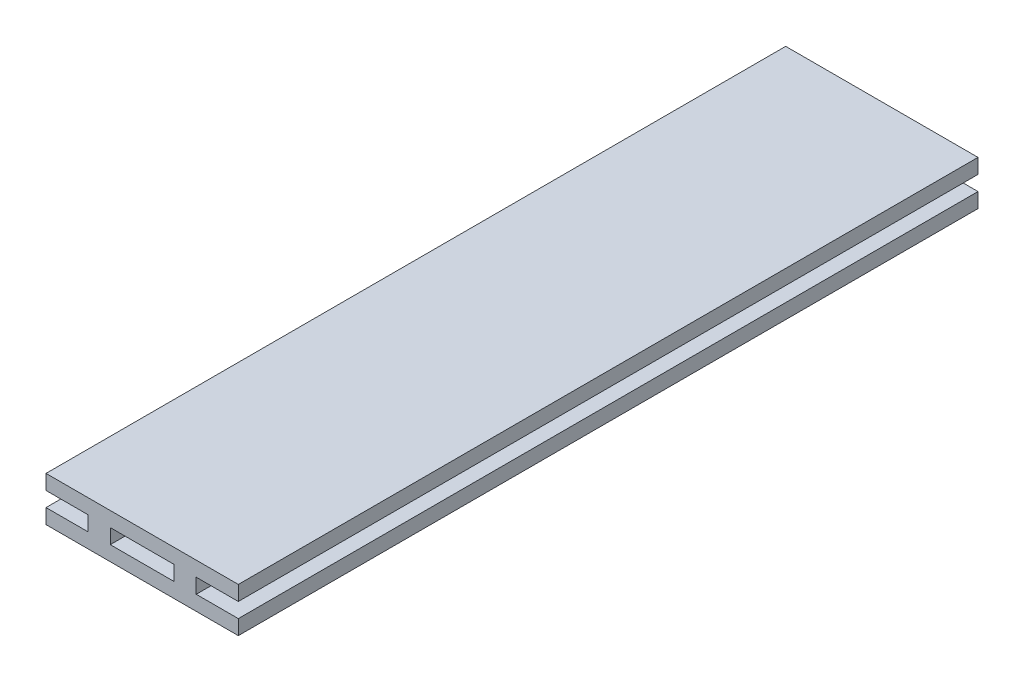
ISO-10303-21;
HEADER;
FILE_DESCRIPTION(('STEP AP214'),'2;1');
FILE_NAME('part.step','',(''),(''),'','','');
FILE_SCHEMA(('AUTOMOTIVE_DESIGN { 1 0 10303 214 1 1 1 1 }'));
ENDSEC;
DATA;
#1=APPLICATION_CONTEXT('core data for automotive mechanical design processes');
#2=APPLICATION_PROTOCOL_DEFINITION('international standard','automotive_design',2000,#1);
#3=PRODUCT_CONTEXT('',#1,'mechanical');
#4=PRODUCT('Part','Part','',(#3));
#5=PRODUCT_RELATED_PRODUCT_CATEGORY('part','',(#4));
#6=PRODUCT_DEFINITION_FORMATION('','',#4);
#7=PRODUCT_DEFINITION_CONTEXT('part definition',#1,'design');
#8=PRODUCT_DEFINITION('design','',#6,#7);
#9=PRODUCT_DEFINITION_SHAPE('','',#8);
#10=(LENGTH_UNIT() NAMED_UNIT(*) SI_UNIT(.MILLI.,.METRE.));
#11=(NAMED_UNIT(*) PLANE_ANGLE_UNIT() SI_UNIT($,.RADIAN.));
#12=(NAMED_UNIT(*) SI_UNIT($,.STERADIAN.) SOLID_ANGLE_UNIT());
#13=UNCERTAINTY_MEASURE_WITH_UNIT(LENGTH_MEASURE(1.E-05),#10,'distance_accuracy_value','');
#14=(GEOMETRIC_REPRESENTATION_CONTEXT(3) GLOBAL_UNCERTAINTY_ASSIGNED_CONTEXT((#13)) GLOBAL_UNIT_ASSIGNED_CONTEXT((#10,
#11,#12)) REPRESENTATION_CONTEXT('',''));
#15=CARTESIAN_POINT('',(0.,0.,0.));
#16=DIRECTION('',(0.,0.,1.));
#17=DIRECTION('',(1.,0.,0.));
#18=AXIS2_PLACEMENT_3D('',#15,#16,#17);
#19=CARTESIAN_POINT('',(0.,1.,100.));
#20=DIRECTION('',(0.,1.,0.));
#21=DIRECTION('',(0.,0.,1.));
#22=AXIS2_PLACEMENT_3D('',#19,#20,#21);
#23=PLANE('',#22);
#24=DIRECTION('',(1.,0.,0.));
#25=VECTOR('',#24,1.);
#26=CARTESIAN_POINT('',(0.,1.,0.));
#27=LINE('',#26,#25);
#28=CARTESIAN_POINT('',(-4.31117093449988,1.,0.));
#29=VERTEX_POINT('',#28);
#30=CARTESIAN_POINT('',(4.31117093449988,1.,0.));
#31=VERTEX_POINT('',#30);
#32=EDGE_CURVE('E236',#29,#31,#27,.T.);
#33=ORIENTED_EDGE('',*,*,#32,.T.);
#34=DIRECTION('',(0.,0.,-1.));
#35=VECTOR('',#34,1.);
#36=CARTESIAN_POINT('',(4.31117093449988,1.,100.));
#37=LINE('',#36,#35);
#38=CARTESIAN_POINT('',(4.31117093449988,1.,100.));
#39=VERTEX_POINT('',#38);
#40=EDGE_CURVE('E11',#39,#31,#37,.T.);
#41=ORIENTED_EDGE('',*,*,#40,.F.);
#42=DIRECTION('',(1.,0.,0.));
#43=VECTOR('',#42,1.);
#44=CARTESIAN_POINT('',(0.,1.,100.));
#45=LINE('',#44,#43);
#46=CARTESIAN_POINT('',(-4.31117093449988,1.,100.));
#47=VERTEX_POINT('',#46);
#48=EDGE_CURVE('E175',#47,#39,#45,.T.);
#49=ORIENTED_EDGE('',*,*,#48,.F.);
#50=DIRECTION('',(0.,0.,-1.));
#51=VECTOR('',#50,1.);
#52=CARTESIAN_POINT('',(-4.31117093449988,1.,100.));
#53=LINE('',#52,#51);
#54=EDGE_CURVE('E67',#47,#29,#53,.T.);
#55=ORIENTED_EDGE('',*,*,#54,.T.);
#56=EDGE_LOOP('',(#33,#41,#49,#55));
#57=FACE_BOUND('',#56,.T.);
#58=ADVANCED_FACE('F47',(#57),#23,.F.);
#59=CARTESIAN_POINT('',(4.31117093449988,0.,100.));
#60=DIRECTION('',(1.,0.,0.));
#61=DIRECTION('',(0.,0.,-1.));
#62=AXIS2_PLACEMENT_3D('',#59,#60,#61);
#63=PLANE('',#62);
#64=DIRECTION('',(0.,-1.,0.));
#65=VECTOR('',#64,1.);
#66=CARTESIAN_POINT('',(4.31117093449988,0.,0.));
#67=LINE('',#66,#65);
#68=CARTESIAN_POINT('',(4.31117093449988,-1.,0.));
#69=VERTEX_POINT('',#68);
#70=EDGE_CURVE('E182',#31,#69,#67,.T.);
#71=ORIENTED_EDGE('',*,*,#70,.T.);
#72=DIRECTION('',(0.,0.,-1.));
#73=VECTOR('',#72,1.);
#74=CARTESIAN_POINT('',(4.31117093449988,-1.,100.));
#75=LINE('',#74,#73);
#76=CARTESIAN_POINT('',(4.31117093449988,-1.,100.));
#77=VERTEX_POINT('',#76);
#78=EDGE_CURVE('E58',#77,#69,#75,.T.);
#79=ORIENTED_EDGE('',*,*,#78,.F.);
#80=DIRECTION('',(0.,-1.,0.));
#81=VECTOR('',#80,1.);
#82=CARTESIAN_POINT('',(4.31117093449988,0.,100.));
#83=LINE('',#82,#81);
#84=EDGE_CURVE('E169',#39,#77,#83,.T.);
#85=ORIENTED_EDGE('',*,*,#84,.F.);
#86=ORIENTED_EDGE('',*,*,#40,.T.);
#87=EDGE_LOOP('',(#71,#79,#85,#86));
#88=FACE_BOUND('',#87,.T.);
#89=ADVANCED_FACE('F181',(#88),#63,.F.);
#90=CARTESIAN_POINT('',(0.,-1.,100.));
#91=DIRECTION('',(0.,1.,0.));
#92=DIRECTION('',(0.,0.,1.));
#93=AXIS2_PLACEMENT_3D('',#90,#91,#92);
#94=PLANE('',#93);
#95=DIRECTION('',(1.,0.,0.));
#96=VECTOR('',#95,1.);
#97=CARTESIAN_POINT('',(0.,-1.,0.));
#98=LINE('',#97,#96);
#99=CARTESIAN_POINT('',(-4.31117093449988,-1.,0.));
#100=VERTEX_POINT('',#99);
#101=EDGE_CURVE('E241',#100,#69,#98,.T.);
#102=ORIENTED_EDGE('',*,*,#101,.F.);
#103=DIRECTION('',(0.,0.,-1.));
#104=VECTOR('',#103,1.);
#105=CARTESIAN_POINT('',(-4.31117093449988,-1.,100.));
#106=LINE('',#105,#104);
#107=CARTESIAN_POINT('',(-4.31117093449988,-1.,100.));
#108=VERTEX_POINT('',#107);
#109=EDGE_CURVE('E117',#108,#100,#106,.T.);
#110=ORIENTED_EDGE('',*,*,#109,.F.);
#111=DIRECTION('',(1.,0.,0.));
#112=VECTOR('',#111,1.);
#113=CARTESIAN_POINT('',(0.,-1.,100.));
#114=LINE('',#113,#112);
#115=EDGE_CURVE('E174',#108,#77,#114,.T.);
#116=ORIENTED_EDGE('',*,*,#115,.T.);
#117=ORIENTED_EDGE('',*,*,#78,.T.);
#118=EDGE_LOOP('',(#102,#110,#116,#117));
#119=FACE_BOUND('',#118,.T.);
#120=ADVANCED_FACE('F187',(#119),#94,.T.);
#121=CARTESIAN_POINT('',(0.,1.,100.));
#122=DIRECTION('',(0.,-1.,0.));
#123=DIRECTION('',(0.,0.,-1.));
#124=AXIS2_PLACEMENT_3D('',#121,#122,#123);
#125=PLANE('',#124);
#126=DIRECTION('',(-1.,0.,0.));
#127=VECTOR('',#126,1.);
#128=CARTESIAN_POINT('',(0.,1.,0.));
#129=LINE('',#128,#127);
#130=CARTESIAN_POINT('',(13.,1.,0.));
#131=VERTEX_POINT('',#130);
#132=CARTESIAN_POINT('',(7.31117093449988,1.,0.));
#133=VERTEX_POINT('',#132);
#134=EDGE_CURVE('E196',#131,#133,#129,.T.);
#135=ORIENTED_EDGE('',*,*,#134,.F.);
#136=DIRECTION('',(0.,0.,-1.));
#137=VECTOR('',#136,1.);
#138=CARTESIAN_POINT('',(13.,1.,100.));
#139=LINE('',#138,#137);
#140=CARTESIAN_POINT('',(13.,1.,100.));
#141=VERTEX_POINT('',#140);
#142=EDGE_CURVE('E51',#141,#131,#139,.T.);
#143=ORIENTED_EDGE('',*,*,#142,.F.);
#144=DIRECTION('',(-1.,0.,0.));
#145=VECTOR('',#144,1.);
#146=CARTESIAN_POINT('',(0.,1.,100.));
#147=LINE('',#146,#145);
#148=CARTESIAN_POINT('',(7.31117093449988,1.,100.));
#149=VERTEX_POINT('',#148);
#150=EDGE_CURVE('E248',#141,#149,#147,.T.);
#151=ORIENTED_EDGE('',*,*,#150,.T.);
#152=DIRECTION('',(0.,0.,-1.));
#153=VECTOR('',#152,1.);
#154=CARTESIAN_POINT('',(7.31117093449988,1.,100.));
#155=LINE('',#154,#153);
#156=EDGE_CURVE('E192',#149,#133,#155,.T.);
#157=ORIENTED_EDGE('',*,*,#156,.T.);
#158=EDGE_LOOP('',(#135,#143,#151,#157));
#159=FACE_BOUND('',#158,.T.);
#160=ADVANCED_FACE('F49',(#159),#125,.T.);
#161=CARTESIAN_POINT('',(13.,0.,100.));
#162=DIRECTION('',(1.,0.,0.));
#163=DIRECTION('',(0.,1.,0.));
#164=AXIS2_PLACEMENT_3D('',#161,#162,#163);
#165=PLANE('',#164);
#166=DIRECTION('',(0.,-1.,0.));
#167=VECTOR('',#166,1.);
#168=CARTESIAN_POINT('',(13.,0.,0.));
#169=LINE('',#168,#167);
#170=CARTESIAN_POINT('',(13.,3.,0.));
#171=VERTEX_POINT('',#170);
#172=EDGE_CURVE('E200',#171,#131,#169,.T.);
#173=ORIENTED_EDGE('',*,*,#172,.F.);
#174=DIRECTION('',(0.,0.,-1.));
#175=VECTOR('',#174,1.);
#176=CARTESIAN_POINT('',(13.,3.,100.));
#177=LINE('',#176,#175);
#178=CARTESIAN_POINT('',(13.,3.,100.));
#179=VERTEX_POINT('',#178);
#180=EDGE_CURVE('E284',#179,#171,#177,.T.);
#181=ORIENTED_EDGE('',*,*,#180,.F.);
#182=DIRECTION('',(0.,-1.,0.));
#183=VECTOR('',#182,1.);
#184=CARTESIAN_POINT('',(13.,0.,100.));
#185=LINE('',#184,#183);
#186=EDGE_CURVE('E295',#179,#141,#185,.T.);
#187=ORIENTED_EDGE('',*,*,#186,.T.);
#188=ORIENTED_EDGE('',*,*,#142,.T.);
#189=EDGE_LOOP('',(#173,#181,#187,#188));
#190=FACE_BOUND('',#189,.T.);
#191=ADVANCED_FACE('F293',(#190),#165,.T.);
#192=CARTESIAN_POINT('',(0.,3.,100.));
#193=DIRECTION('',(0.,1.,0.));
#194=DIRECTION('',(0.,0.,1.));
#195=AXIS2_PLACEMENT_3D('',#192,#193,#194);
#196=PLANE('',#195);
#197=DIRECTION('',(1.,0.,0.));
#198=VECTOR('',#197,1.);
#199=CARTESIAN_POINT('',(0.,3.,0.));
#200=LINE('',#199,#198);
#201=CARTESIAN_POINT('',(-13.,3.,0.));
#202=VERTEX_POINT('',#201);
#203=EDGE_CURVE('E204',#202,#171,#200,.T.);
#204=ORIENTED_EDGE('',*,*,#203,.F.);
#205=DIRECTION('',(0.,0.,-1.));
#206=VECTOR('',#205,1.);
#207=CARTESIAN_POINT('',(-13.,3.,100.));
#208=LINE('',#207,#206);
#209=CARTESIAN_POINT('',(-13.,3.,100.));
#210=VERTEX_POINT('',#209);
#211=EDGE_CURVE('E282',#210,#202,#208,.T.);
#212=ORIENTED_EDGE('',*,*,#211,.F.);
#213=DIRECTION('',(1.,0.,0.));
#214=VECTOR('',#213,1.);
#215=CARTESIAN_POINT('',(0.,3.,100.));
#216=LINE('',#215,#214);
#217=EDGE_CURVE('E305',#210,#179,#216,.T.);
#218=ORIENTED_EDGE('',*,*,#217,.T.);
#219=ORIENTED_EDGE('',*,*,#180,.T.);
#220=EDGE_LOOP('',(#204,#212,#218,#219));
#221=FACE_BOUND('',#220,.T.);
#222=ADVANCED_FACE('F302',(#221),#196,.T.);
#223=CARTESIAN_POINT('',(-13.,0.,100.));
#224=DIRECTION('',(1.,0.,0.));
#225=DIRECTION('',(0.,0.,-1.));
#226=AXIS2_PLACEMENT_3D('',#223,#224,#225);
#227=PLANE('',#226);
#228=DIRECTION('',(0.,-1.,0.));
#229=VECTOR('',#228,1.);
#230=CARTESIAN_POINT('',(-13.,0.,0.));
#231=LINE('',#230,#229);
#232=CARTESIAN_POINT('',(-13.,1.,0.));
#233=VERTEX_POINT('',#232);
#234=EDGE_CURVE('E209',#202,#233,#231,.T.);
#235=ORIENTED_EDGE('',*,*,#234,.T.);
#236=DIRECTION('',(0.,0.,-1.));
#237=VECTOR('',#236,1.);
#238=CARTESIAN_POINT('',(-13.,1.,100.));
#239=LINE('',#238,#237);
#240=CARTESIAN_POINT('',(-13.,1.,100.));
#241=VERTEX_POINT('',#240);
#242=EDGE_CURVE('E278',#241,#233,#239,.T.);
#243=ORIENTED_EDGE('',*,*,#242,.F.);
#244=DIRECTION('',(0.,-1.,0.));
#245=VECTOR('',#244,1.);
#246=CARTESIAN_POINT('',(-13.,0.,100.));
#247=LINE('',#246,#245);
#248=EDGE_CURVE('E308',#210,#241,#247,.T.);
#249=ORIENTED_EDGE('',*,*,#248,.F.);
#250=ORIENTED_EDGE('',*,*,#211,.T.);
#251=EDGE_LOOP('',(#235,#243,#249,#250));
#252=FACE_BOUND('',#251,.T.);
#253=ADVANCED_FACE('F309',(#252),#227,.F.);
#254=CARTESIAN_POINT('',(0.,1.,100.));
#255=DIRECTION('',(0.,1.,0.));
#256=DIRECTION('',(0.,0.,1.));
#257=AXIS2_PLACEMENT_3D('',#254,#255,#256);
#258=PLANE('',#257);
#259=DIRECTION('',(1.,0.,0.));
#260=VECTOR('',#259,1.);
#261=CARTESIAN_POINT('',(0.,1.,0.));
#262=LINE('',#261,#260);
#263=CARTESIAN_POINT('',(-7.31117093449988,1.,0.));
#264=VERTEX_POINT('',#263);
#265=EDGE_CURVE('E212',#233,#264,#262,.T.);
#266=ORIENTED_EDGE('',*,*,#265,.T.);
#267=DIRECTION('',(0.,0.,-1.));
#268=VECTOR('',#267,1.);
#269=CARTESIAN_POINT('',(-7.31117093449988,1.,100.));
#270=LINE('',#269,#268);
#271=CARTESIAN_POINT('',(-7.31117093449988,1.,100.));
#272=VERTEX_POINT('',#271);
#273=EDGE_CURVE('E274',#272,#264,#270,.T.);
#274=ORIENTED_EDGE('',*,*,#273,.F.);
#275=DIRECTION('',(1.,0.,0.));
#276=VECTOR('',#275,1.);
#277=CARTESIAN_POINT('',(0.,1.,100.));
#278=LINE('',#277,#276);
#279=EDGE_CURVE('E313',#241,#272,#278,.T.);
#280=ORIENTED_EDGE('',*,*,#279,.F.);
#281=ORIENTED_EDGE('',*,*,#242,.T.);
#282=EDGE_LOOP('',(#266,#274,#280,#281));
#283=FACE_BOUND('',#282,.T.);
#284=ADVANCED_FACE('F382',(#283),#258,.F.);
#285=CARTESIAN_POINT('',(-7.31117093449988,0.,100.));
#286=DIRECTION('',(1.,0.,0.));
#287=DIRECTION('',(0.,1.,0.));
#288=AXIS2_PLACEMENT_3D('',#285,#286,#287);
#289=PLANE('',#288);
#290=DIRECTION('',(0.,-1.,0.));
#291=VECTOR('',#290,1.);
#292=CARTESIAN_POINT('',(-7.31117093449988,0.,0.));
#293=LINE('',#292,#291);
#294=CARTESIAN_POINT('',(-7.31117093449988,-0.999999999999998,0.));
#295=VERTEX_POINT('',#294);
#296=EDGE_CURVE('E216',#264,#295,#293,.T.);
#297=ORIENTED_EDGE('',*,*,#296,.T.);
#298=DIRECTION('',(0.,0.,-1.));
#299=VECTOR('',#298,1.);
#300=CARTESIAN_POINT('',(-7.31117093449988,-0.999999999999998,100.));
#301=LINE('',#300,#299);
#302=CARTESIAN_POINT('',(-7.31117093449988,-0.999999999999998,100.));
#303=VERTEX_POINT('',#302);
#304=EDGE_CURVE('E271',#303,#295,#301,.T.);
#305=ORIENTED_EDGE('',*,*,#304,.F.);
#306=DIRECTION('',(0.,-1.,0.));
#307=VECTOR('',#306,1.);
#308=CARTESIAN_POINT('',(-7.31117093449988,0.,100.));
#309=LINE('',#308,#307);
#310=EDGE_CURVE('E325',#272,#303,#309,.T.);
#311=ORIENTED_EDGE('',*,*,#310,.F.);
#312=ORIENTED_EDGE('',*,*,#273,.T.);
#313=EDGE_LOOP('',(#297,#305,#311,#312));
#314=FACE_BOUND('',#313,.T.);
#315=ADVANCED_FACE('F379',(#314),#289,.F.);
#316=CARTESIAN_POINT('',(0.,-0.999999999999998,100.));
#317=DIRECTION('',(0.,1.,0.));
#318=DIRECTION('',(0.,0.,1.));
#319=AXIS2_PLACEMENT_3D('',#316,#317,#318);
#320=PLANE('',#319);
#321=DIRECTION('',(1.,0.,0.));
#322=VECTOR('',#321,1.);
#323=CARTESIAN_POINT('',(0.,-0.999999999999998,0.));
#324=LINE('',#323,#322);
#325=CARTESIAN_POINT('',(-13.,-0.999999999999998,0.));
#326=VERTEX_POINT('',#325);
#327=EDGE_CURVE('E220',#326,#295,#324,.T.);
#328=ORIENTED_EDGE('',*,*,#327,.F.);
#329=DIRECTION('',(0.,0.,-1.));
#330=VECTOR('',#329,1.);
#331=CARTESIAN_POINT('',(-13.,-0.999999999999998,100.));
#332=LINE('',#331,#330);
#333=CARTESIAN_POINT('',(-13.,-0.999999999999998,100.));
#334=VERTEX_POINT('',#333);
#335=EDGE_CURVE('E268',#334,#326,#332,.T.);
#336=ORIENTED_EDGE('',*,*,#335,.F.);
#337=DIRECTION('',(1.,0.,0.));
#338=VECTOR('',#337,1.);
#339=CARTESIAN_POINT('',(0.,-0.999999999999998,100.));
#340=LINE('',#339,#338);
#341=EDGE_CURVE('E328',#334,#303,#340,.T.);
#342=ORIENTED_EDGE('',*,*,#341,.T.);
#343=ORIENTED_EDGE('',*,*,#304,.T.);
#344=EDGE_LOOP('',(#328,#336,#342,#343));
#345=FACE_BOUND('',#344,.T.);
#346=ADVANCED_FACE('F375',(#345),#320,.T.);
#347=CARTESIAN_POINT('',(-13.,-3.,0.));
#348=VERTEX_POINT('',#347);
#349=EDGE_CURVE('E213',#326,#348,#231,.T.);
#350=ORIENTED_EDGE('',*,*,#349,.T.);
#351=DIRECTION('',(0.,0.,-1.));
#352=VECTOR('',#351,1.);
#353=CARTESIAN_POINT('',(-13.,-3.,100.));
#354=LINE('',#353,#352);
#355=CARTESIAN_POINT('',(-13.,-3.,100.));
#356=VERTEX_POINT('',#355);
#357=EDGE_CURVE('E264',#356,#348,#354,.T.);
#358=ORIENTED_EDGE('',*,*,#357,.F.);
#359=EDGE_CURVE('E315',#334,#356,#247,.T.);
#360=ORIENTED_EDGE('',*,*,#359,.F.);
#361=ORIENTED_EDGE('',*,*,#335,.T.);
#362=EDGE_LOOP('',(#350,#358,#360,#361));
#363=FACE_BOUND('',#362,.T.);
#364=ADVANCED_FACE('F352',(#363),#227,.F.);
#365=CARTESIAN_POINT('',(0.,-3.,100.));
#366=DIRECTION('',(0.,1.,0.));
#367=DIRECTION('',(0.,0.,1.));
#368=AXIS2_PLACEMENT_3D('',#365,#366,#367);
#369=PLANE('',#368);
#370=DIRECTION('',(1.,0.,0.));
#371=VECTOR('',#370,1.);
#372=CARTESIAN_POINT('',(0.,-3.,0.));
#373=LINE('',#372,#371);
#374=CARTESIAN_POINT('',(13.,-3.,0.));
#375=VERTEX_POINT('',#374);
#376=EDGE_CURVE('E224',#348,#375,#373,.T.);
#377=ORIENTED_EDGE('',*,*,#376,.T.);
#378=DIRECTION('',(0.,0.,-1.));
#379=VECTOR('',#378,1.);
#380=CARTESIAN_POINT('',(13.,-3.,100.));
#381=LINE('',#380,#379);
#382=CARTESIAN_POINT('',(13.,-3.,100.));
#383=VERTEX_POINT('',#382);
#384=EDGE_CURVE('E261',#383,#375,#381,.T.);
#385=ORIENTED_EDGE('',*,*,#384,.F.);
#386=DIRECTION('',(1.,0.,0.));
#387=VECTOR('',#386,1.);
#388=CARTESIAN_POINT('',(0.,-3.,100.));
#389=LINE('',#388,#387);
#390=EDGE_CURVE('E332',#356,#383,#389,.T.);
#391=ORIENTED_EDGE('',*,*,#390,.F.);
#392=ORIENTED_EDGE('',*,*,#357,.T.);
#393=EDGE_LOOP('',(#377,#385,#391,#392));
#394=FACE_BOUND('',#393,.T.);
#395=ADVANCED_FACE('F356',(#394),#369,.F.);
#396=CARTESIAN_POINT('',(13.,-0.999999999999998,0.));
#397=VERTEX_POINT('',#396);
#398=EDGE_CURVE('E205',#397,#375,#169,.T.);
#399=ORIENTED_EDGE('',*,*,#398,.F.);
#400=DIRECTION('',(0.,0.,-1.));
#401=VECTOR('',#400,1.);
#402=CARTESIAN_POINT('',(13.,-0.999999999999998,100.));
#403=LINE('',#402,#401);
#404=CARTESIAN_POINT('',(13.,-0.999999999999998,100.));
#405=VERTEX_POINT('',#404);
#406=EDGE_CURVE('E258',#405,#397,#403,.T.);
#407=ORIENTED_EDGE('',*,*,#406,.F.);
#408=EDGE_CURVE('E320',#405,#383,#185,.T.);
#409=ORIENTED_EDGE('',*,*,#408,.T.);
#410=ORIENTED_EDGE('',*,*,#384,.T.);
#411=EDGE_LOOP('',(#399,#407,#409,#410));
#412=FACE_BOUND('',#411,.T.);
#413=ADVANCED_FACE('F360',(#412),#165,.T.);
#414=CARTESIAN_POINT('',(0.,-0.999999999999998,100.));
#415=DIRECTION('',(0.,-1.,0.));
#416=DIRECTION('',(0.,0.,-1.));
#417=AXIS2_PLACEMENT_3D('',#414,#415,#416);
#418=PLANE('',#417);
#419=DIRECTION('',(-1.,0.,0.));
#420=VECTOR('',#419,1.);
#421=CARTESIAN_POINT('',(0.,-0.999999999999998,0.));
#422=LINE('',#421,#420);
#423=CARTESIAN_POINT('',(7.31117093449988,-0.999999999999998,0.));
#424=VERTEX_POINT('',#423);
#425=EDGE_CURVE('E228',#397,#424,#422,.T.);
#426=ORIENTED_EDGE('',*,*,#425,.T.);
#427=DIRECTION('',(0.,0.,-1.));
#428=VECTOR('',#427,1.);
#429=CARTESIAN_POINT('',(7.31117093449988,-0.999999999999998,100.));
#430=LINE('',#429,#428);
#431=CARTESIAN_POINT('',(7.31117093449988,-0.999999999999998,100.));
#432=VERTEX_POINT('',#431);
#433=EDGE_CURVE('E255',#432,#424,#430,.T.);
#434=ORIENTED_EDGE('',*,*,#433,.F.);
#435=DIRECTION('',(-1.,0.,0.));
#436=VECTOR('',#435,1.);
#437=CARTESIAN_POINT('',(0.,-0.999999999999998,100.));
#438=LINE('',#437,#436);
#439=EDGE_CURVE('E335',#405,#432,#438,.T.);
#440=ORIENTED_EDGE('',*,*,#439,.F.);
#441=ORIENTED_EDGE('',*,*,#406,.T.);
#442=EDGE_LOOP('',(#426,#434,#440,#441));
#443=FACE_BOUND('',#442,.T.);
#444=ADVANCED_FACE('F365',(#443),#418,.F.);
#445=CARTESIAN_POINT('',(7.31117093449988,0.,100.));
#446=DIRECTION('',(1.,0.,0.));
#447=DIRECTION('',(0.,1.,0.));
#448=AXIS2_PLACEMENT_3D('',#445,#446,#447);
#449=PLANE('',#448);
#450=DIRECTION('',(0.,-1.,0.));
#451=VECTOR('',#450,1.);
#452=CARTESIAN_POINT('',(7.31117093449988,0.,0.));
#453=LINE('',#452,#451);
#454=EDGE_CURVE('E232',#133,#424,#453,.T.);
#455=ORIENTED_EDGE('',*,*,#454,.F.);
#456=ORIENTED_EDGE('',*,*,#156,.F.);
#457=DIRECTION('',(0.,-1.,0.));
#458=VECTOR('',#457,1.);
#459=CARTESIAN_POINT('',(7.31117093449988,0.,100.));
#460=LINE('',#459,#458);
#461=EDGE_CURVE('E338',#149,#432,#460,.T.);
#462=ORIENTED_EDGE('',*,*,#461,.T.);
#463=ORIENTED_EDGE('',*,*,#433,.T.);
#464=EDGE_LOOP('',(#455,#456,#462,#463));
#465=FACE_BOUND('',#464,.T.);
#466=ADVANCED_FACE('F368',(#465),#449,.T.);
#467=CARTESIAN_POINT('',(-4.31117093449988,0.,100.));
#468=DIRECTION('',(1.,0.,0.));
#469=DIRECTION('',(0.,0.,-1.));
#470=AXIS2_PLACEMENT_3D('',#467,#468,#469);
#471=PLANE('',#470);
#472=DIRECTION('',(0.,-1.,0.));
#473=VECTOR('',#472,1.);
#474=CARTESIAN_POINT('',(-4.31117093449988,0.,0.));
#475=LINE('',#474,#473);
#476=EDGE_CURVE('E244',#29,#100,#475,.T.);
#477=ORIENTED_EDGE('',*,*,#476,.F.);
#478=ORIENTED_EDGE('',*,*,#54,.F.);
#479=DIRECTION('',(0.,-1.,0.));
#480=VECTOR('',#479,1.);
#481=CARTESIAN_POINT('',(-4.31117093449988,0.,100.));
#482=LINE('',#481,#480);
#483=EDGE_CURVE('E189',#47,#108,#482,.T.);
#484=ORIENTED_EDGE('',*,*,#483,.T.);
#485=ORIENTED_EDGE('',*,*,#109,.T.);
#486=EDGE_LOOP('',(#477,#478,#484,#485));
#487=FACE_BOUND('',#486,.T.);
#488=ADVANCED_FACE('F401',(#487),#471,.T.);
#489=CARTESIAN_POINT('',(0.,0.,100.));
#490=DIRECTION('',(0.,0.,1.));
#491=DIRECTION('',(1.,0.,0.));
#492=AXIS2_PLACEMENT_3D('',#489,#490,#491);
#493=PLANE('',#492);
#494=ORIENTED_EDGE('',*,*,#150,.F.);
#495=ORIENTED_EDGE('',*,*,#186,.F.);
#496=ORIENTED_EDGE('',*,*,#217,.F.);
#497=ORIENTED_EDGE('',*,*,#248,.T.);
#498=ORIENTED_EDGE('',*,*,#279,.T.);
#499=ORIENTED_EDGE('',*,*,#310,.T.);
#500=ORIENTED_EDGE('',*,*,#341,.F.);
#501=ORIENTED_EDGE('',*,*,#359,.T.);
#502=ORIENTED_EDGE('',*,*,#390,.T.);
#503=ORIENTED_EDGE('',*,*,#408,.F.);
#504=ORIENTED_EDGE('',*,*,#439,.T.);
#505=ORIENTED_EDGE('',*,*,#461,.F.);
#506=EDGE_LOOP('',(#494,#495,#496,#497,#498,#499,#500,#501,#502,#503,#504,#505));
#507=FACE_BOUND('',#506,.T.);
#508=ORIENTED_EDGE('',*,*,#48,.T.);
#509=ORIENTED_EDGE('',*,*,#84,.T.);
#510=ORIENTED_EDGE('',*,*,#115,.F.);
#511=ORIENTED_EDGE('',*,*,#483,.F.);
#512=EDGE_LOOP('',(#508,#509,#510,#511));
#513=FACE_BOUND('',#512,.T.);
#514=ADVANCED_FACE('F171',(#507,#513),#493,.T.);
#515=CARTESIAN_POINT('',(0.,0.,0.));
#516=DIRECTION('',(0.,0.,1.));
#517=DIRECTION('',(1.,0.,0.));
#518=AXIS2_PLACEMENT_3D('',#515,#516,#517);
#519=PLANE('',#518);
#520=ORIENTED_EDGE('',*,*,#134,.T.);
#521=ORIENTED_EDGE('',*,*,#454,.T.);
#522=ORIENTED_EDGE('',*,*,#425,.F.);
#523=ORIENTED_EDGE('',*,*,#398,.T.);
#524=ORIENTED_EDGE('',*,*,#376,.F.);
#525=ORIENTED_EDGE('',*,*,#349,.F.);
#526=ORIENTED_EDGE('',*,*,#327,.T.);
#527=ORIENTED_EDGE('',*,*,#296,.F.);
#528=ORIENTED_EDGE('',*,*,#265,.F.);
#529=ORIENTED_EDGE('',*,*,#234,.F.);
#530=ORIENTED_EDGE('',*,*,#203,.T.);
#531=ORIENTED_EDGE('',*,*,#172,.T.);
#532=EDGE_LOOP('',(#520,#521,#522,#523,#524,#525,#526,#527,#528,#529,#530,#531));
#533=FACE_BOUND('',#532,.T.);
#534=ORIENTED_EDGE('',*,*,#32,.F.);
#535=ORIENTED_EDGE('',*,*,#476,.T.);
#536=ORIENTED_EDGE('',*,*,#101,.T.);
#537=ORIENTED_EDGE('',*,*,#70,.F.);
#538=EDGE_LOOP('',(#534,#535,#536,#537));
#539=FACE_BOUND('',#538,.T.);
#540=ADVANCED_FACE('F298',(#533,#539),#519,.F.);
#541=CLOSED_SHELL('',(#58,#89,#120,#160,#191,#222,#253,#284,#315,#346,#364,#395,#413,#444,#466,
#488,#514,#540));
#542=MANIFOLD_SOLID_BREP('B2',#541);
#543=ADVANCED_BREP_SHAPE_REPRESENTATION('',(#18,#542),#14);
#544=SHAPE_DEFINITION_REPRESENTATION(#9,#543);
ENDSEC;
END-ISO-10303-21;
